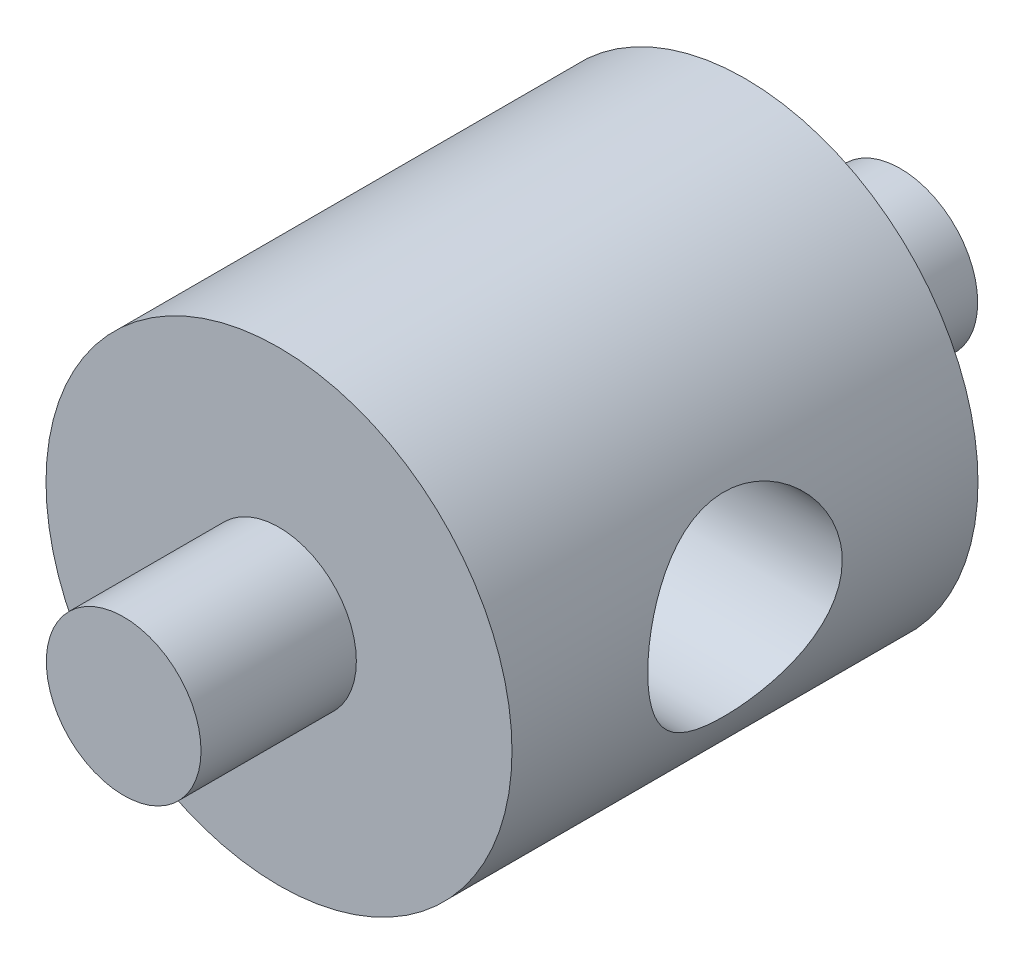
ISO-10303-21;
HEADER;
FILE_DESCRIPTION(('STEP AP214'),'2;1');
FILE_NAME('part.step','',(''),(''),'','','');
FILE_SCHEMA(('AUTOMOTIVE_DESIGN { 1 0 10303 214 1 1 1 1 }'));
ENDSEC;
DATA;
#1=APPLICATION_CONTEXT('core data for automotive mechanical design processes');
#2=APPLICATION_PROTOCOL_DEFINITION('international standard','automotive_design',2000,#1);
#3=PRODUCT_CONTEXT('',#1,'mechanical');
#4=PRODUCT('Part','Part','',(#3));
#5=PRODUCT_RELATED_PRODUCT_CATEGORY('part','',(#4));
#6=PRODUCT_DEFINITION_FORMATION('','',#4);
#7=PRODUCT_DEFINITION_CONTEXT('part definition',#1,'design');
#8=PRODUCT_DEFINITION('design','',#6,#7);
#9=PRODUCT_DEFINITION_SHAPE('','',#8);
#10=(LENGTH_UNIT() NAMED_UNIT(*) SI_UNIT(.MILLI.,.METRE.));
#11=(NAMED_UNIT(*) PLANE_ANGLE_UNIT() SI_UNIT($,.RADIAN.));
#12=(NAMED_UNIT(*) SI_UNIT($,.STERADIAN.) SOLID_ANGLE_UNIT());
#13=UNCERTAINTY_MEASURE_WITH_UNIT(LENGTH_MEASURE(1.E-05),#10,'distance_accuracy_value','');
#14=(GEOMETRIC_REPRESENTATION_CONTEXT(3) GLOBAL_UNCERTAINTY_ASSIGNED_CONTEXT((#13)) GLOBAL_UNIT_ASSIGNED_CONTEXT((#10,
#11,#12)) REPRESENTATION_CONTEXT('',''));
#15=CARTESIAN_POINT('',(0.,0.,0.));
#16=DIRECTION('',(0.,0.,1.));
#17=DIRECTION('',(1.,0.,0.));
#18=AXIS2_PLACEMENT_3D('',#15,#16,#17);
#19=CARTESIAN_POINT('',(0.,0.,19.05));
#20=DIRECTION('',(0.,0.,-1.));
#21=DIRECTION('',(-1.,0.,0.));
#22=AXIS2_PLACEMENT_3D('',#19,#20,#21);
#23=CYLINDRICAL_SURFACE('',#22,9.525);
#24=CARTESIAN_POINT('',(-9.525,0.,5.54990000000001));
#25=CARTESIAN_POINT('',(-9.52499939987079,0.106495089398162,5.54990076064134));
#26=CARTESIAN_POINT('',(-9.52320896806071,0.213026297327606,5.55418564214138));
#27=CARTESIAN_POINT('',(-9.51609257689966,0.425328381802362,5.5712838760483));
#28=CARTESIAN_POINT('',(-9.51076438535651,0.531098735658728,5.58410261300777));
#29=CARTESIAN_POINT('',(-9.49669639261034,0.741274953049408,5.61817508971566));
#30=CARTESIAN_POINT('',(-9.48794961248671,0.845677570892996,5.63944608592653));
#31=CARTESIAN_POINT('',(-9.46727957428478,1.05215975131759,5.69019812205939));
#32=CARTESIAN_POINT('',(-9.45535501804121,1.15423834596324,5.71968251749157));
#33=CARTESIAN_POINT('',(-9.41534993177929,1.45515913620936,5.8198129644269));
#34=CARTESIAN_POINT('',(-9.38296998003945,1.64964082702754,5.90229353303397));
#35=CARTESIAN_POINT('',(-9.30990648216109,2.0217171631127,6.09598252959613));
#36=CARTESIAN_POINT('',(-9.26922543719321,2.19931687145325,6.2071823069514));
#37=CARTESIAN_POINT('',(-9.1813294237912,2.54194737990277,6.4611109117431));
#38=CARTESIAN_POINT('',(-9.13389999360055,2.70602439183176,6.60505464222373));
#39=CARTESIAN_POINT('',(-9.03878764835578,3.00851180363545,6.91776197058417));
#40=CARTESIAN_POINT('',(-8.99110461302777,3.14690864942422,7.08653859157541));
#41=CARTESIAN_POINT('',(-8.8982305165937,3.40093341476996,7.45440959268439));
#42=CARTESIAN_POINT('',(-8.85327890045829,3.51509892420984,7.65458975209634));
#43=CARTESIAN_POINT('',(-8.79410788695065,3.65950657370326,7.96847901710668));
#44=CARTESIAN_POINT('',(-8.77575474685782,3.70318079527965,8.0754229150154));
#45=CARTESIAN_POINT('',(-8.74243084335056,3.78118114320912,8.29315834864022));
#46=CARTESIAN_POINT('',(-8.7274583398846,3.8155120805324,8.40394787093403));
#47=CARTESIAN_POINT('',(-8.70208220341632,3.87302606264631,8.62316028462667));
#48=CARTESIAN_POINT('',(-8.69149430964974,3.8966637328838,8.73144295869));
#49=CARTESIAN_POINT('',(-8.67428034936028,3.93483487823948,8.94986805178706));
#50=CARTESIAN_POINT('',(-8.66765245023281,3.9493725647929,9.06000958627449));
#51=CARTESIAN_POINT('',(-8.6586024366737,3.969174751066,9.28126730333191));
#52=CARTESIAN_POINT('',(-8.65617922901649,3.97444166120542,9.39238322500619));
#53=CARTESIAN_POINT('',(-8.65562784737983,3.97564234799001,9.61467161537232));
#54=CARTESIAN_POINT('',(-8.65749944622587,3.9715766182867,9.72584408076229));
#55=CARTESIAN_POINT('',(-8.66515825388582,3.95483687587718,9.93874779031982));
#56=CARTESIAN_POINT('',(-8.67063182281959,3.94285209384154,10.0405449583526));
#57=CARTESIAN_POINT('',(-8.68499206897733,3.91111628669909,10.242686864164));
#58=CARTESIAN_POINT('',(-8.69387986206853,3.89136272247926,10.3430311159498));
#59=CARTESIAN_POINT('',(-8.72527671909227,3.82072027250218,10.6408149100619));
#60=CARTESIAN_POINT('',(-8.75252630423334,3.75843544073415,10.8351814800587));
#61=CARTESIAN_POINT('',(-8.81721559644979,3.6040824396307,11.2146573063664));
#62=CARTESIAN_POINT('',(-8.85486009642729,3.51140782420465,11.3994809934832));
#63=CARTESIAN_POINT('',(-8.93605122199606,3.29931713333661,11.7517024453964));
#64=CARTESIAN_POINT('',(-8.97960017667421,3.1798904930345,11.9190932872818));
#65=CARTESIAN_POINT('',(-9.07218610239713,2.90580121973726,12.2466019342766));
#66=CARTESIAN_POINT('',(-9.12137527983627,2.74900925699876,12.4048989875827));
#67=CARTESIAN_POINT('',(-9.21658403162916,2.41061750114363,12.6935662523372));
#68=CARTESIAN_POINT('',(-9.26260285704735,2.22901187629149,12.8239298802874));
#69=CARTESIAN_POINT('',(-9.34762979322195,1.84060220284839,13.0557074939926));
#70=CARTESIAN_POINT('',(-9.38645027803762,1.63331091660065,13.1563788844904));
#71=CARTESIAN_POINT('',(-9.45126551899768,1.20270101783884,13.3207818400195));
#72=CARTESIAN_POINT('',(-9.47726738553035,0.979391369513746,13.3845338873607));
#73=CARTESIAN_POINT('',(-9.51218610574712,0.538291998146048,13.4694735301834));
#74=CARTESIAN_POINT('',(-9.52208167778347,0.321049992111253,13.4931035682688));
#75=CARTESIAN_POINT('',(-9.52679856004406,-0.1145028711815,13.5044129209408));
#76=CARTESIAN_POINT('',(-9.52162421573177,-0.332813402203352,13.4921025990543));
#77=CARTESIAN_POINT('',(-9.49741715832968,-0.752853682146127,13.4336272208547));
#78=CARTESIAN_POINT('',(-9.47908771799828,-0.954867629684399,13.3891793765152));
#79=CARTESIAN_POINT('',(-9.43116586809558,-1.34834953782995,13.2700827903486));
#80=CARTESIAN_POINT('',(-9.40157203674518,-1.5398161636722,13.1954302360411));
#81=CARTESIAN_POINT('',(-9.33281462208408,-1.91348544879026,13.0156052436592));
#82=CARTESIAN_POINT('',(-9.29338222037203,-2.09521529619992,12.9095564359305));
#83=CARTESIAN_POINT('',(-9.20915377734553,-2.43895074577703,12.6709120293291));
#84=CARTESIAN_POINT('',(-9.16435549668252,-2.60094805565897,12.5383053313972));
#85=CARTESIAN_POINT('',(-9.0702521817603,-2.91282662156204,12.2391889726263));
#86=CARTESIAN_POINT('',(-9.02085428698802,-3.06100688672714,12.0709304135118));
#87=CARTESIAN_POINT('',(-8.92599537837258,-3.32750523560762,11.7111508311518));
#88=CARTESIAN_POINT('',(-8.88053527082887,-3.44581645676084,11.5196244769588));
#89=CARTESIAN_POINT('',(-8.79839390490288,-3.65051832376315,11.1147474712859));
#90=CARTESIAN_POINT('',(-8.7618488999396,-3.73642333974119,10.9011216002318));
#91=CARTESIAN_POINT('',(-8.70354830592954,-3.87031053693042,10.4604319740318));
#92=CARTESIAN_POINT('',(-8.68178047139786,-3.91832412323203,10.2333795152315));
#93=CARTESIAN_POINT('',(-8.65737301551702,-3.97193974247196,9.79116247316757));
#94=CARTESIAN_POINT('',(-8.65338684822142,-3.9805288633259,9.57643272628556));
#95=CARTESIAN_POINT('',(-8.66141453705411,-3.96303160961833,9.14871798718906));
#96=CARTESIAN_POINT('',(-8.67342591795322,-3.93695059941251,8.93573273018726));
#97=CARTESIAN_POINT('',(-8.71086302566554,-3.8533645175565,8.52783558585755));
#98=CARTESIAN_POINT('',(-8.73563391564704,-3.79738893384761,8.33254444867609));
#99=CARTESIAN_POINT('',(-8.79528297235972,-3.65710320585637,7.95408315584679));
#100=CARTESIAN_POINT('',(-8.83016398065227,-3.57278509452536,7.77091642570187));
#101=CARTESIAN_POINT('',(-8.9087096785376,-3.37234956159755,7.40985497864134));
#102=CARTESIAN_POINT('',(-8.95277690089425,-3.2546226129284,7.23294242645419));
#103=CARTESIAN_POINT('',(-9.04360379329542,-2.99299948829989,6.90046341046671));
#104=CARTESIAN_POINT('',(-9.09036439782665,-2.84909419175837,6.74490441953102));
#105=CARTESIAN_POINT('',(-9.18544173914824,-2.52654828430715,6.44776061906333));
#106=CARTESIAN_POINT('',(-9.23362201442697,-2.34613660363502,6.30803096249628));
#107=CARTESIAN_POINT('',(-9.30036315803464,-2.0587917968878,6.12266867068155));
#108=CARTESIAN_POINT('',(-9.32170392268049,-1.96013432201534,6.06488243195848));
#109=CARTESIAN_POINT('',(-9.36195803138827,-1.75783232804063,5.95785607800281));
#110=CARTESIAN_POINT('',(-9.3808724938658,-1.65419013717941,5.908612021496));
#111=CARTESIAN_POINT('',(-9.41545367099769,-1.44429746479125,5.81984048001856));
#112=CARTESIAN_POINT('',(-9.43116730162713,-1.33811478757094,5.78017077060979));
#113=CARTESIAN_POINT('',(-9.45926446946656,-1.12239075194387,5.70996199925888));
#114=CARTESIAN_POINT('',(-9.47164958649125,-1.01285101450209,5.67941860491517));
#115=CARTESIAN_POINT('',(-9.49270710988958,-0.791497960215454,5.62784254578487));
#116=CARTESIAN_POINT('',(-9.50138867565581,-0.679690977202885,5.60678641035955));
#117=CARTESIAN_POINT('',(-9.5148174576836,-0.45450667586335,5.57433338073211));
#118=CARTESIAN_POINT('',(-9.51956755821659,-0.34113057090169,5.56292940520163));
#119=CARTESIAN_POINT('',(-9.52318825939483,-0.189604430593866,5.55424298691759));
#120=CARTESIAN_POINT('',(-9.52386729013256,-0.151706541777502,5.55261481522414));
#121=CARTESIAN_POINT('',(-9.52477326801928,-0.0758739633967886,5.55044318463114));
#122=CARTESIAN_POINT('',(-9.52500021379828,-0.037939273721266,5.54989972901869));
#123=CARTESIAN_POINT('',(-9.525,0.,5.54990000000001));
#124=B_SPLINE_CURVE_WITH_KNOTS('',3,(#24,#25,#26,#27,#28,#29,#30,#31,#32,#33,#34,#35,#36,#37,
#38,#39,#40,#41,#42,#43,#44,#45,#46,#47,#48,#49,#50,#51,#52,#53,#54,#55,#56,#57,#58,#59,#60,#61,
#62,#63,#64,#65,#66,#67,#68,#69,#70,#71,#72,#73,#74,#75,#76,#77,#78,#79,#80,#81,#82,#83,#84,#85,
#86,#87,#88,#89,#90,#91,#92,#93,#94,#95,#96,#97,#98,#99,#100,#101,#102,#103,#104,#105,#106,#107,
#108,#109,#110,#111,#112,#113,#114,#115,#116,#117,#118,#119,#120,#121,#122,#123),.UNSPECIFIED.,
.T.,.F.,(4,2,2,2,2,2,2,2,2,2,2,2,2,2,2,2,2,2,2,2,2,2,2,2,2,2,2,2,2,2,2,2,2,2,2,2,2,2,2,2,2,2,2,
2,2,2,2,2,2,4),(0.,0.319446471242752,0.639094692871247,0.959398901772485,1.27983416046834,
1.91783225026157,2.55563839039337,3.2227795844738,3.89027190271142,4.59073627233886,
4.94124157134432,5.29156604798551,5.62513624505026,5.95855195283427,6.29188095907973,
6.62519233423823,6.93275618829412,7.24042064875462,7.85522603220028,8.48313399964362,
9.11129037788716,9.79271941995831,10.4743088886253,11.17172674605,11.8687573146942,
12.5215938905714,13.1742422373615,13.7943753740058,14.4145868091452,15.0540725829767,
15.6938261701482,16.3794403050341,17.0652118201321,17.7608864050227,18.4559837951257,
19.0974381508274,19.7387932686911,20.3501004283862,20.961579569652,21.6098918138228,
22.2584303652184,22.9544193539213,23.3029873514636,23.6513940930912,23.994253457639,
24.3369498020602,24.6787936274048,25.0203864403458,25.1341900950817,25.2479940946864),.UNSPECIFIED.);
#125=CARTESIAN_POINT('',(-9.525,0.,5.54990000000001));
#126=VERTEX_POINT('',#125);
#127=EDGE_CURVE('E10',#126,#126,#124,.T.);
#128=ORIENTED_EDGE('',*,*,#127,.T.);
#129=EDGE_LOOP('',(#128));
#130=FACE_BOUND('',#129,.T.);
#131=CARTESIAN_POINT('',(9.52499999999999,0.,5.54990000000001));
#132=CARTESIAN_POINT('',(9.52499939987078,-0.106495089398162,5.54990076064134));
#133=CARTESIAN_POINT('',(9.52320896806071,-0.213026297327607,5.55418564214138));
#134=CARTESIAN_POINT('',(9.51609257689967,-0.425328381802364,5.5712838760483));
#135=CARTESIAN_POINT('',(9.51076438535652,-0.531098735658729,5.58410261300777));
#136=CARTESIAN_POINT('',(9.49669639261034,-0.74127495304941,5.61817508971566));
#137=CARTESIAN_POINT('',(9.48794961248671,-0.845677570892997,5.63944608592653));
#138=CARTESIAN_POINT('',(9.46727957428478,-1.05215975131759,5.69019812205939));
#139=CARTESIAN_POINT('',(9.45535501804121,-1.15423834596324,5.71968251749157));
#140=CARTESIAN_POINT('',(9.41534993177929,-1.45515913620936,5.8198129644269));
#141=CARTESIAN_POINT('',(9.38296998003945,-1.64964082702754,5.90229353303397));
#142=CARTESIAN_POINT('',(9.30990648216109,-2.0217171631127,6.09598252959613));
#143=CARTESIAN_POINT('',(9.26922543719321,-2.19931687145325,6.2071823069514));
#144=CARTESIAN_POINT('',(9.1813294237912,-2.54194737990277,6.4611109117431));
#145=CARTESIAN_POINT('',(9.13389999360055,-2.70602439183176,6.60505464222373));
#146=CARTESIAN_POINT('',(9.03878764835578,-3.00851180363545,6.91776197058417));
#147=CARTESIAN_POINT('',(8.99110461302777,-3.14690864942422,7.08653859157541));
#148=CARTESIAN_POINT('',(8.8982305165937,-3.40093341476996,7.45440959268439));
#149=CARTESIAN_POINT('',(8.85327890045829,-3.51509892420984,7.65458975209634));
#150=CARTESIAN_POINT('',(8.79410788695065,-3.65950657370326,7.96847901710668));
#151=CARTESIAN_POINT('',(8.77575474685782,-3.70318079527965,8.0754229150154));
#152=CARTESIAN_POINT('',(8.74243084335056,-3.78118114320912,8.29315834864022));
#153=CARTESIAN_POINT('',(8.7274583398846,-3.8155120805324,8.40394787093403));
#154=CARTESIAN_POINT('',(8.70208220341632,-3.87302606264631,8.62316028462667));
#155=CARTESIAN_POINT('',(8.69149430964974,-3.89666373288381,8.73144295869001));
#156=CARTESIAN_POINT('',(8.67428034936028,-3.93483487823948,8.94986805178707));
#157=CARTESIAN_POINT('',(8.66765245023281,-3.9493725647929,9.06000958627449));
#158=CARTESIAN_POINT('',(8.6586024366737,-3.969174751066,9.28126730333191));
#159=CARTESIAN_POINT('',(8.65617922901649,-3.97444166120542,9.39238322500619));
#160=CARTESIAN_POINT('',(8.65562784737983,-3.97564234799001,9.61467161537232));
#161=CARTESIAN_POINT('',(8.65749944622587,-3.9715766182867,9.72584408076229));
#162=CARTESIAN_POINT('',(8.66515825388582,-3.95483687587718,9.93874779031983));
#163=CARTESIAN_POINT('',(8.67063182281959,-3.94285209384154,10.0405449583526));
#164=CARTESIAN_POINT('',(8.68499206897733,-3.91111628669909,10.242686864164));
#165=CARTESIAN_POINT('',(8.69387986206853,-3.89136272247926,10.3430311159498));
#166=CARTESIAN_POINT('',(8.72527671909227,-3.82072027250218,10.6408149100619));
#167=CARTESIAN_POINT('',(8.75252630423334,-3.75843544073415,10.8351814800587));
#168=CARTESIAN_POINT('',(8.81721559644979,-3.6040824396307,11.2146573063664));
#169=CARTESIAN_POINT('',(8.8548600964273,-3.51140782420465,11.3994809934832));
#170=CARTESIAN_POINT('',(8.93605122199606,-3.29931713333661,11.7517024453964));
#171=CARTESIAN_POINT('',(8.97960017667421,-3.1798904930345,11.9190932872818));
#172=CARTESIAN_POINT('',(9.07218610239713,-2.90580121973726,12.2466019342766));
#173=CARTESIAN_POINT('',(9.12137527983627,-2.74900925699876,12.4048989875827));
#174=CARTESIAN_POINT('',(9.21658403162916,-2.41061750114363,12.6935662523372));
#175=CARTESIAN_POINT('',(9.26260285704736,-2.22901187629149,12.8239298802874));
#176=CARTESIAN_POINT('',(9.34762979322195,-1.84060220284839,13.0557074939926));
#177=CARTESIAN_POINT('',(9.38645027803762,-1.63331091660065,13.1563788844904));
#178=CARTESIAN_POINT('',(9.45126551899768,-1.20270101783884,13.3207818400195));
#179=CARTESIAN_POINT('',(9.47726738553035,-0.979391369513745,13.3845338873607));
#180=CARTESIAN_POINT('',(9.51218610574712,-0.538291998146048,13.4694735301834));
#181=CARTESIAN_POINT('',(9.52208167778347,-0.321049992111252,13.4931035682688));
#182=CARTESIAN_POINT('',(9.52679856004406,0.114502871181501,13.5044129209408));
#183=CARTESIAN_POINT('',(9.52162421573177,0.332813402203352,13.4921025990543));
#184=CARTESIAN_POINT('',(9.49741715832968,0.752853682146128,13.4336272208547));
#185=CARTESIAN_POINT('',(9.47908771799828,0.954867629684399,13.3891793765152));
#186=CARTESIAN_POINT('',(9.43116586809558,1.34834953782995,13.2700827903486));
#187=CARTESIAN_POINT('',(9.40157203674518,1.53981616367221,13.1954302360411));
#188=CARTESIAN_POINT('',(9.33281462208408,1.91348544879026,13.0156052436592));
#189=CARTESIAN_POINT('',(9.29338222037202,2.09521529619992,12.9095564359305));
#190=CARTESIAN_POINT('',(9.20915377734553,2.43895074577703,12.6709120293291));
#191=CARTESIAN_POINT('',(9.16435549668252,2.60094805565898,12.5383053313972));
#192=CARTESIAN_POINT('',(9.0702521817603,2.91282662156204,12.2391889726263));
#193=CARTESIAN_POINT('',(9.02085428698802,3.06100688672714,12.0709304135118));
#194=CARTESIAN_POINT('',(8.92599537837258,3.32750523560762,11.7111508311518));
#195=CARTESIAN_POINT('',(8.88053527082887,3.44581645676084,11.5196244769588));
#196=CARTESIAN_POINT('',(8.79839390490288,3.65051832376315,11.1147474712859));
#197=CARTESIAN_POINT('',(8.7618488999396,3.73642333974119,10.9011216002318));
#198=CARTESIAN_POINT('',(8.70354830592954,3.87031053693042,10.4604319740318));
#199=CARTESIAN_POINT('',(8.68178047139786,3.91832412323203,10.2333795152315));
#200=CARTESIAN_POINT('',(8.65737301551703,3.97193974247196,9.79116247316757));
#201=CARTESIAN_POINT('',(8.65338684822143,3.9805288633259,9.57643272628556));
#202=CARTESIAN_POINT('',(8.66141453705411,3.96303160961833,9.14871798718906));
#203=CARTESIAN_POINT('',(8.67342591795322,3.93695059941251,8.93573273018726));
#204=CARTESIAN_POINT('',(8.71086302566554,3.8533645175565,8.52783558585755));
#205=CARTESIAN_POINT('',(8.73563391564704,3.79738893384761,8.33254444867609));
#206=CARTESIAN_POINT('',(8.79528297235972,3.65710320585637,7.95408315584679));
#207=CARTESIAN_POINT('',(8.83016398065227,3.57278509452535,7.77091642570187));
#208=CARTESIAN_POINT('',(8.9087096785376,3.37234956159755,7.40985497864133));
#209=CARTESIAN_POINT('',(8.95277690089425,3.2546226129284,7.23294242645419));
#210=CARTESIAN_POINT('',(9.04360379329542,2.99299948829989,6.90046341046671));
#211=CARTESIAN_POINT('',(9.09036439782665,2.84909419175837,6.74490441953102));
#212=CARTESIAN_POINT('',(9.18544173914824,2.52654828430714,6.44776061906333));
#213=CARTESIAN_POINT('',(9.23362201442697,2.34613660363502,6.30803096249628));
#214=CARTESIAN_POINT('',(9.30036315803464,2.0587917968878,6.12266867068155));
#215=CARTESIAN_POINT('',(9.32170392268049,1.96013432201533,6.06488243195848));
#216=CARTESIAN_POINT('',(9.36195803138827,1.75783232804063,5.95785607800281));
#217=CARTESIAN_POINT('',(9.3808724938658,1.65419013717941,5.908612021496));
#218=CARTESIAN_POINT('',(9.41545367099769,1.44429746479125,5.81984048001856));
#219=CARTESIAN_POINT('',(9.43116730162713,1.33811478757094,5.78017077060979));
#220=CARTESIAN_POINT('',(9.45926446946656,1.12239075194387,5.70996199925888));
#221=CARTESIAN_POINT('',(9.47164958649125,1.01285101450208,5.67941860491517));
#222=CARTESIAN_POINT('',(9.49270710988958,0.791497960215451,5.62784254578487));
#223=CARTESIAN_POINT('',(9.50138867565581,0.679690977202883,5.60678641035955));
#224=CARTESIAN_POINT('',(9.5148174576836,0.454506675863347,5.57433338073211));
#225=CARTESIAN_POINT('',(9.51956755821659,0.341130570901687,5.56292940520163));
#226=CARTESIAN_POINT('',(9.52318825939483,0.189604430593864,5.55424298691759));
#227=CARTESIAN_POINT('',(9.52386729013256,0.151706541777501,5.55261481522414));
#228=CARTESIAN_POINT('',(9.52477326801928,0.0758739633967888,5.55044318463114));
#229=CARTESIAN_POINT('',(9.52500021379827,0.0379392737212661,5.54989972901869));
#230=CARTESIAN_POINT('',(9.52499999999999,0.,5.54990000000001));
#231=B_SPLINE_CURVE_WITH_KNOTS('',3,(#131,#132,#133,#134,#135,#136,#137,#138,#139,#140,#141,
#142,#143,#144,#145,#146,#147,#148,#149,#150,#151,#152,#153,#154,#155,#156,#157,#158,#159,#160,
#161,#162,#163,#164,#165,#166,#167,#168,#169,#170,#171,#172,#173,#174,#175,#176,#177,#178,#179,
#180,#181,#182,#183,#184,#185,#186,#187,#188,#189,#190,#191,#192,#193,#194,#195,#196,#197,#198,
#199,#200,#201,#202,#203,#204,#205,#206,#207,#208,#209,#210,#211,#212,#213,#214,#215,#216,#217,
#218,#219,#220,#221,#222,#223,#224,#225,#226,#227,#228,#229,#230),.UNSPECIFIED.,.T.,.F.,(4,2,2,
2,2,2,2,2,2,2,2,2,2,2,2,2,2,2,2,2,2,2,2,2,2,2,2,2,2,2,2,2,2,2,2,2,2,2,2,2,2,2,2,2,2,2,2,2,2,4),
(0.,0.319446471242753,0.639094692871248,0.959398901772486,1.27983416046834,1.91783225026157,
2.55563839039337,3.2227795844738,3.89027190271142,4.59073627233886,4.94124157134433,
5.29156604798551,5.62513624505027,5.95855195283427,6.29188095907973,6.62519233423824,
6.93275618829413,7.24042064875462,7.85522603220029,8.48313399964362,9.11129037788717,
9.79271941995831,10.4743088886253,11.17172674605,11.8687573146942,12.5215938905714,
13.1742422373615,13.7943753740058,14.4145868091452,15.0540725829767,15.6938261701482,
16.379440305034,17.0652118201321,17.7608864050227,18.4559837951257,19.0974381508274,
19.7387932686911,20.3501004283862,20.961579569652,21.6098918138228,22.2584303652184,
22.9544193539213,23.3029873514636,23.6513940930912,23.994253457639,24.3369498020602,
24.6787936274048,25.0203864403458,25.1341900950817,25.2479940946864),.UNSPECIFIED.);
#232=CARTESIAN_POINT('',(9.52499999999999,0.,5.54990000000001));
#233=VERTEX_POINT('',#232);
#234=EDGE_CURVE('E53',#233,#233,#231,.T.);
#235=ORIENTED_EDGE('',*,*,#234,.T.);
#236=EDGE_LOOP('',(#235));
#237=FACE_BOUND('',#236,.T.);
#238=CARTESIAN_POINT('',(0.,0.,19.05));
#239=DIRECTION('',(0.,0.,1.));
#240=DIRECTION('',(1.,0.,0.));
#241=AXIS2_PLACEMENT_3D('',#238,#239,#240);
#242=CIRCLE('',#241,9.525);
#243=CARTESIAN_POINT('',(9.525,0.,19.05));
#244=VERTEX_POINT('',#243);
#245=EDGE_CURVE('E63',#244,#244,#242,.T.);
#246=ORIENTED_EDGE('',*,*,#245,.F.);
#247=EDGE_LOOP('',(#246));
#248=FACE_BOUND('',#247,.T.);
#249=CARTESIAN_POINT('',(0.,0.,0.));
#250=DIRECTION('',(0.,0.,1.));
#251=DIRECTION('',(1.,0.,0.));
#252=AXIS2_PLACEMENT_3D('',#249,#250,#251);
#253=CIRCLE('',#252,9.525);
#254=CARTESIAN_POINT('',(9.525,0.,0.));
#255=VERTEX_POINT('',#254);
#256=EDGE_CURVE('E109',#255,#255,#253,.T.);
#257=ORIENTED_EDGE('',*,*,#256,.T.);
#258=EDGE_LOOP('',(#257));
#259=FACE_BOUND('',#258,.T.);
#260=ADVANCED_FACE('F41',(#130,#237,#248,#259),#23,.T.);
#261=CARTESIAN_POINT('',(0.,0.,19.05));
#262=DIRECTION('',(0.,0.,1.));
#263=DIRECTION('',(1.,0.,0.));
#264=AXIS2_PLACEMENT_3D('',#261,#262,#263);
#265=PLANE('',#264);
#266=CARTESIAN_POINT('',(0.,0.,19.05));
#267=DIRECTION('',(0.,0.,1.));
#268=DIRECTION('',(1.,0.,0.));
#269=AXIS2_PLACEMENT_3D('',#266,#267,#268);
#270=CIRCLE('',#269,3.1623);
#271=CARTESIAN_POINT('',(3.1623,0.,19.05));
#272=VERTEX_POINT('',#271);
#273=EDGE_CURVE('E58',#272,#272,#270,.T.);
#274=ORIENTED_EDGE('',*,*,#273,.F.);
#275=EDGE_LOOP('',(#274));
#276=FACE_BOUND('',#275,.T.);
#277=ORIENTED_EDGE('',*,*,#245,.T.);
#278=EDGE_LOOP('',(#277));
#279=FACE_BOUND('',#278,.T.);
#280=ADVANCED_FACE('F91',(#276,#279),#265,.T.);
#281=CARTESIAN_POINT('',(0.,0.,0.));
#282=DIRECTION('',(0.,0.,1.));
#283=DIRECTION('',(1.,0.,0.));
#284=AXIS2_PLACEMENT_3D('',#281,#282,#283);
#285=PLANE('',#284);
#286=CARTESIAN_POINT('',(0.,0.,0.));
#287=DIRECTION('',(0.,0.,1.));
#288=DIRECTION('',(1.,0.,0.));
#289=AXIS2_PLACEMENT_3D('',#286,#287,#288);
#290=CIRCLE('',#289,3.1623);
#291=CARTESIAN_POINT('',(3.1623,0.,0.));
#292=VERTEX_POINT('',#291);
#293=EDGE_CURVE('E69',#292,#292,#290,.T.);
#294=ORIENTED_EDGE('',*,*,#293,.T.);
#295=EDGE_LOOP('',(#294));
#296=FACE_BOUND('',#295,.T.);
#297=ORIENTED_EDGE('',*,*,#256,.F.);
#298=EDGE_LOOP('',(#297));
#299=FACE_BOUND('',#298,.T.);
#300=ADVANCED_FACE('F86',(#296,#299),#285,.F.);
#301=CARTESIAN_POINT('',(0.,0.,-6.35));
#302=DIRECTION('',(0.,0.,1.));
#303=DIRECTION('',(1.,0.,0.));
#304=AXIS2_PLACEMENT_3D('',#301,#302,#303);
#305=PLANE('',#304);
#306=CARTESIAN_POINT('',(0.,0.,-6.35));
#307=DIRECTION('',(0.,0.,1.));
#308=DIRECTION('',(1.,0.,0.));
#309=AXIS2_PLACEMENT_3D('',#306,#307,#308);
#310=CIRCLE('',#309,3.1623);
#311=CARTESIAN_POINT('',(3.1623,0.,-6.35));
#312=VERTEX_POINT('',#311);
#313=EDGE_CURVE('E114',#312,#312,#310,.T.);
#314=ORIENTED_EDGE('',*,*,#313,.F.);
#315=EDGE_LOOP('',(#314));
#316=FACE_BOUND('',#315,.T.);
#317=ADVANCED_FACE('F82',(#316),#305,.F.);
#318=CARTESIAN_POINT('',(0.,0.,-6.35));
#319=DIRECTION('',(0.,0.,1.));
#320=DIRECTION('',(1.,0.,0.));
#321=AXIS2_PLACEMENT_3D('',#318,#319,#320);
#322=CYLINDRICAL_SURFACE('',#321,3.1623);
#323=ORIENTED_EDGE('',*,*,#313,.T.);
#324=EDGE_LOOP('',(#323));
#325=FACE_BOUND('',#324,.T.);
#326=ORIENTED_EDGE('',*,*,#293,.F.);
#327=EDGE_LOOP('',(#326));
#328=FACE_BOUND('',#327,.T.);
#329=ADVANCED_FACE('F85',(#325,#328),#322,.T.);
#330=ORIENTED_EDGE('',*,*,#273,.T.);
#331=EDGE_LOOP('',(#330));
#332=FACE_BOUND('',#331,.T.);
#333=CARTESIAN_POINT('',(0.,0.,25.4));
#334=DIRECTION('',(0.,0.,1.));
#335=DIRECTION('',(1.,0.,0.));
#336=AXIS2_PLACEMENT_3D('',#333,#334,#335);
#337=CIRCLE('',#336,3.1623);
#338=CARTESIAN_POINT('',(3.1623,0.,25.4));
#339=VERTEX_POINT('',#338);
#340=EDGE_CURVE('E119',#339,#339,#337,.T.);
#341=ORIENTED_EDGE('',*,*,#340,.F.);
#342=EDGE_LOOP('',(#341));
#343=FACE_BOUND('',#342,.T.);
#344=ADVANCED_FACE('F80',(#332,#343),#322,.T.);
#345=CARTESIAN_POINT('',(0.,0.,25.4));
#346=DIRECTION('',(0.,0.,1.));
#347=DIRECTION('',(1.,0.,0.));
#348=AXIS2_PLACEMENT_3D('',#345,#346,#347);
#349=PLANE('',#348);
#350=ORIENTED_EDGE('',*,*,#340,.T.);
#351=EDGE_LOOP('',(#350));
#352=FACE_BOUND('',#351,.T.);
#353=ADVANCED_FACE('F75',(#352),#349,.T.);
#354=CARTESIAN_POINT('',(-9.525,0.,9.52500000000001));
#355=DIRECTION('',(1.,0.,0.));
#356=DIRECTION('',(0.,0.,-1.));
#357=AXIS2_PLACEMENT_3D('',#354,#355,#356);
#358=CYLINDRICAL_SURFACE('',#357,3.9751);
#359=ORIENTED_EDGE('',*,*,#234,.F.);
#360=EDGE_LOOP('',(#359));
#361=FACE_BOUND('',#360,.T.);
#362=ORIENTED_EDGE('',*,*,#127,.F.);
#363=EDGE_LOOP('',(#362));
#364=FACE_BOUND('',#363,.T.);
#365=ADVANCED_FACE('F71',(#361,#364),#358,.F.);
#366=CLOSED_SHELL('',(#260,#280,#300,#317,#329,#344,#353,#365));
#367=MANIFOLD_SOLID_BREP('B2',#366);
#368=ADVANCED_BREP_SHAPE_REPRESENTATION('',(#18,#367),#14);
#369=SHAPE_DEFINITION_REPRESENTATION(#9,#368);
ENDSEC;
END-ISO-10303-21;
